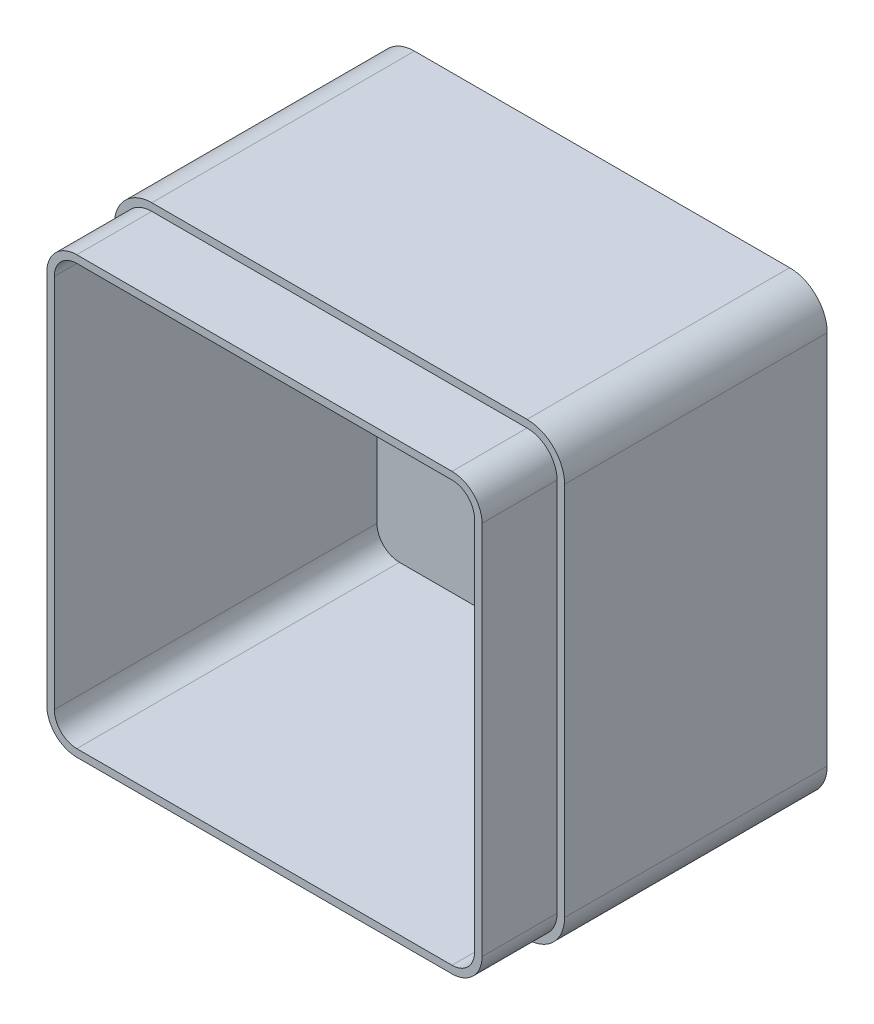
ISO-10303-21;
HEADER;
FILE_DESCRIPTION(('STEP AP214'),'2;1');
FILE_NAME('part.step','',(''),(''),'','','');
FILE_SCHEMA(('AUTOMOTIVE_DESIGN { 1 0 10303 214 1 1 1 1 }'));
ENDSEC;
DATA;
#1=APPLICATION_CONTEXT('core data for automotive mechanical design processes');
#2=APPLICATION_PROTOCOL_DEFINITION('international standard','automotive_design',2000,#1);
#3=PRODUCT_CONTEXT('',#1,'mechanical');
#4=PRODUCT('Part','Part','',(#3));
#5=PRODUCT_RELATED_PRODUCT_CATEGORY('part','',(#4));
#6=PRODUCT_DEFINITION_FORMATION('','',#4);
#7=PRODUCT_DEFINITION_CONTEXT('part definition',#1,'design');
#8=PRODUCT_DEFINITION('design','',#6,#7);
#9=PRODUCT_DEFINITION_SHAPE('','',#8);
#10=(LENGTH_UNIT() NAMED_UNIT(*) SI_UNIT(.MILLI.,.METRE.));
#11=(NAMED_UNIT(*) PLANE_ANGLE_UNIT() SI_UNIT($,.RADIAN.));
#12=(NAMED_UNIT(*) SI_UNIT($,.STERADIAN.) SOLID_ANGLE_UNIT());
#13=UNCERTAINTY_MEASURE_WITH_UNIT(LENGTH_MEASURE(1.E-05),#10,'distance_accuracy_value','');
#14=(GEOMETRIC_REPRESENTATION_CONTEXT(3) GLOBAL_UNCERTAINTY_ASSIGNED_CONTEXT((#13)) GLOBAL_UNIT_ASSIGNED_CONTEXT((#10,
#11,#12)) REPRESENTATION_CONTEXT('',''));
#15=CARTESIAN_POINT('',(0.,0.,0.));
#16=DIRECTION('',(0.,0.,1.));
#17=DIRECTION('',(1.,0.,0.));
#18=AXIS2_PLACEMENT_3D('',#15,#16,#17);
#19=CARTESIAN_POINT('',(0.,0.,90.));
#20=DIRECTION('',(0.,0.,-1.));
#21=DIRECTION('',(-1.,0.,0.));
#22=AXIS2_PLACEMENT_3D('',#19,#20,#21);
#23=PLANE('',#22);
#24=DIRECTION('',(0.,1.,0.));
#25=VECTOR('',#24,1.);
#26=CARTESIAN_POINT('',(116.,0.,90.));
#27=LINE('',#26,#25);
#28=CARTESIAN_POINT('',(116.,10.,90.));
#29=VERTEX_POINT('',#28);
#30=CARTESIAN_POINT('',(116.,110.,90.));
#31=VERTEX_POINT('',#30);
#32=EDGE_CURVE('E391',#29,#31,#27,.T.);
#33=ORIENTED_EDGE('',*,*,#32,.F.);
#34=CARTESIAN_POINT('',(110.,10.,90.));
#35=DIRECTION('',(0.,0.,-1.));
#36=DIRECTION('',(-1.,0.,0.));
#37=AXIS2_PLACEMENT_3D('',#34,#35,#36);
#38=CIRCLE('',#37,6.);
#39=CARTESIAN_POINT('',(110.,4.,90.));
#40=VERTEX_POINT('',#39);
#41=EDGE_CURVE('E373',#40,#29,#38,.F.);
#42=ORIENTED_EDGE('',*,*,#41,.F.);
#43=DIRECTION('',(1.,0.,0.));
#44=VECTOR('',#43,1.);
#45=CARTESIAN_POINT('',(0.,4.,90.));
#46=LINE('',#45,#44);
#47=CARTESIAN_POINT('',(9.99999999999999,4.,90.));
#48=VERTEX_POINT('',#47);
#49=EDGE_CURVE('E384',#48,#40,#46,.T.);
#50=ORIENTED_EDGE('',*,*,#49,.F.);
#51=CARTESIAN_POINT('',(9.99999999999999,10.,90.));
#52=DIRECTION('',(0.,0.,-1.));
#53=DIRECTION('',(-1.,0.,0.));
#54=AXIS2_PLACEMENT_3D('',#51,#52,#53);
#55=CIRCLE('',#54,6.);
#56=CARTESIAN_POINT('',(4.,10.,90.));
#57=VERTEX_POINT('',#56);
#58=EDGE_CURVE('E385',#57,#48,#55,.F.);
#59=ORIENTED_EDGE('',*,*,#58,.F.);
#60=DIRECTION('',(0.,-1.,0.));
#61=VECTOR('',#60,1.);
#62=CARTESIAN_POINT('',(4.,0.,90.));
#63=LINE('',#62,#61);
#64=CARTESIAN_POINT('',(3.99999999999999,110.,90.));
#65=VERTEX_POINT('',#64);
#66=EDGE_CURVE('E337',#65,#57,#63,.T.);
#67=ORIENTED_EDGE('',*,*,#66,.F.);
#68=CARTESIAN_POINT('',(9.99999999999999,110.,90.));
#69=DIRECTION('',(0.,0.,-1.));
#70=DIRECTION('',(-1.,0.,0.));
#71=AXIS2_PLACEMENT_3D('',#68,#69,#70);
#72=CIRCLE('',#71,6.);
#73=CARTESIAN_POINT('',(9.99999999999998,116.,90.));
#74=VERTEX_POINT('',#73);
#75=EDGE_CURVE('E388',#74,#65,#72,.F.);
#76=ORIENTED_EDGE('',*,*,#75,.F.);
#77=DIRECTION('',(-1.,0.,0.));
#78=VECTOR('',#77,1.);
#79=CARTESIAN_POINT('',(0.,116.,90.));
#80=LINE('',#79,#78);
#81=CARTESIAN_POINT('',(110.,116.,90.));
#82=VERTEX_POINT('',#81);
#83=EDGE_CURVE('E380',#82,#74,#80,.T.);
#84=ORIENTED_EDGE('',*,*,#83,.F.);
#85=CARTESIAN_POINT('',(110.,110.,90.));
#86=DIRECTION('',(0.,0.,-1.));
#87=DIRECTION('',(-1.,0.,0.));
#88=AXIS2_PLACEMENT_3D('',#85,#86,#87);
#89=CIRCLE('',#88,6.);
#90=EDGE_CURVE('E332',#31,#82,#89,.F.);
#91=ORIENTED_EDGE('',*,*,#90,.F.);
#92=EDGE_LOOP('',(#33,#42,#50,#59,#67,#76,#84,#91));
#93=FACE_BOUND('',#92,.T.);
#94=CARTESIAN_POINT('',(110.,10.,90.));
#95=DIRECTION('',(0.,0.,1.));
#96=DIRECTION('',(1.,0.,0.));
#97=AXIS2_PLACEMENT_3D('',#94,#95,#96);
#98=CIRCLE('',#97,7.99999999999999);
#99=CARTESIAN_POINT('',(110.,2.,90.));
#100=VERTEX_POINT('',#99);
#101=CARTESIAN_POINT('',(118.,10.,90.));
#102=VERTEX_POINT('',#101);
#103=EDGE_CURVE('E255',#100,#102,#98,.T.);
#104=ORIENTED_EDGE('',*,*,#103,.T.);
#105=DIRECTION('',(0.,1.,0.));
#106=VECTOR('',#105,1.);
#107=CARTESIAN_POINT('',(118.,10.,90.));
#108=LINE('',#107,#106);
#109=CARTESIAN_POINT('',(118.,110.,90.));
#110=VERTEX_POINT('',#109);
#111=EDGE_CURVE('E205',#102,#110,#108,.T.);
#112=ORIENTED_EDGE('',*,*,#111,.T.);
#113=CARTESIAN_POINT('',(110.,110.,90.));
#114=DIRECTION('',(0.,0.,1.));
#115=DIRECTION('',(1.,0.,0.));
#116=AXIS2_PLACEMENT_3D('',#113,#114,#115);
#117=CIRCLE('',#116,7.99999999999999);
#118=CARTESIAN_POINT('',(110.,118.,90.));
#119=VERTEX_POINT('',#118);
#120=EDGE_CURVE('E54',#110,#119,#117,.T.);
#121=ORIENTED_EDGE('',*,*,#120,.T.);
#122=DIRECTION('',(-1.,0.,0.));
#123=VECTOR('',#122,1.);
#124=CARTESIAN_POINT('',(110.,118.,90.));
#125=LINE('',#124,#123);
#126=CARTESIAN_POINT('',(9.99999999999998,118.,90.));
#127=VERTEX_POINT('',#126);
#128=EDGE_CURVE('E262',#119,#127,#125,.T.);
#129=ORIENTED_EDGE('',*,*,#128,.T.);
#130=CARTESIAN_POINT('',(9.99999999999999,110.,90.));
#131=DIRECTION('',(0.,0.,1.));
#132=DIRECTION('',(1.,0.,0.));
#133=AXIS2_PLACEMENT_3D('',#130,#131,#132);
#134=CIRCLE('',#133,7.99999999999999);
#135=CARTESIAN_POINT('',(1.99999999999999,110.,90.));
#136=VERTEX_POINT('',#135);
#137=EDGE_CURVE('E266',#127,#136,#134,.T.);
#138=ORIENTED_EDGE('',*,*,#137,.T.);
#139=DIRECTION('',(0.,-1.,0.));
#140=VECTOR('',#139,1.);
#141=CARTESIAN_POINT('',(1.99999999999999,110.,90.));
#142=LINE('',#141,#140);
#143=CARTESIAN_POINT('',(2.,9.99999999999999,90.));
#144=VERTEX_POINT('',#143);
#145=EDGE_CURVE('E270',#136,#144,#142,.T.);
#146=ORIENTED_EDGE('',*,*,#145,.T.);
#147=CARTESIAN_POINT('',(9.99999999999999,10.,90.));
#148=DIRECTION('',(0.,0.,1.));
#149=DIRECTION('',(1.,0.,0.));
#150=AXIS2_PLACEMENT_3D('',#147,#148,#149);
#151=CIRCLE('',#150,8.);
#152=CARTESIAN_POINT('',(9.99999999999999,2.,90.));
#153=VERTEX_POINT('',#152);
#154=EDGE_CURVE('E232',#144,#153,#151,.T.);
#155=ORIENTED_EDGE('',*,*,#154,.T.);
#156=DIRECTION('',(1.,0.,0.));
#157=VECTOR('',#156,1.);
#158=CARTESIAN_POINT('',(10.,2.,90.));
#159=LINE('',#158,#157);
#160=EDGE_CURVE('E228',#153,#100,#159,.T.);
#161=ORIENTED_EDGE('',*,*,#160,.T.);
#162=EDGE_LOOP('',(#104,#112,#121,#129,#138,#146,#155,#161));
#163=FACE_BOUND('',#162,.T.);
#164=ADVANCED_FACE('F38',(#93,#163),#23,.F.);
#165=CARTESIAN_POINT('',(4.,0.,90.));
#166=DIRECTION('',(1.,0.,0.));
#167=DIRECTION('',(0.,1.,0.));
#168=AXIS2_PLACEMENT_3D('',#165,#166,#167);
#169=PLANE('',#168);
#170=ORIENTED_EDGE('',*,*,#66,.T.);
#171=DIRECTION('',(0.,0.,1.));
#172=VECTOR('',#171,1.);
#173=CARTESIAN_POINT('',(4.,10.,90.));
#174=LINE('',#173,#172);
#175=CARTESIAN_POINT('',(4.,10.,4.));
#176=VERTEX_POINT('',#175);
#177=EDGE_CURVE('E325',#176,#57,#174,.T.);
#178=ORIENTED_EDGE('',*,*,#177,.F.);
#179=DIRECTION('',(0.,-1.,0.));
#180=VECTOR('',#179,1.);
#181=CARTESIAN_POINT('',(4.,0.,4.));
#182=LINE('',#181,#180);
#183=CARTESIAN_POINT('',(3.99999999999999,110.,4.));
#184=VERTEX_POINT('',#183);
#185=EDGE_CURVE('E319',#184,#176,#182,.T.);
#186=ORIENTED_EDGE('',*,*,#185,.F.);
#187=DIRECTION('',(0.,0.,1.));
#188=VECTOR('',#187,1.);
#189=CARTESIAN_POINT('',(3.99999999999999,110.,90.));
#190=LINE('',#189,#188);
#191=EDGE_CURVE('E320',#65,#184,#190,.F.);
#192=ORIENTED_EDGE('',*,*,#191,.F.);
#193=EDGE_LOOP('',(#170,#178,#186,#192));
#194=FACE_BOUND('',#193,.T.);
#195=ADVANCED_FACE('F505',(#194),#169,.T.);
#196=CARTESIAN_POINT('',(0.,4.,90.));
#197=DIRECTION('',(0.,1.,0.));
#198=DIRECTION('',(0.,0.,1.));
#199=AXIS2_PLACEMENT_3D('',#196,#197,#198);
#200=PLANE('',#199);
#201=ORIENTED_EDGE('',*,*,#49,.T.);
#202=DIRECTION('',(0.,0.,1.));
#203=VECTOR('',#202,1.);
#204=CARTESIAN_POINT('',(110.,4.,90.));
#205=LINE('',#204,#203);
#206=CARTESIAN_POINT('',(110.,4.,4.));
#207=VERTEX_POINT('',#206);
#208=EDGE_CURVE('E324',#207,#40,#205,.T.);
#209=ORIENTED_EDGE('',*,*,#208,.F.);
#210=DIRECTION('',(1.,0.,0.));
#211=VECTOR('',#210,1.);
#212=CARTESIAN_POINT('',(0.,4.,4.));
#213=LINE('',#212,#211);
#214=CARTESIAN_POINT('',(9.99999999999999,4.,4.));
#215=VERTEX_POINT('',#214);
#216=EDGE_CURVE('E329',#215,#207,#213,.T.);
#217=ORIENTED_EDGE('',*,*,#216,.F.);
#218=DIRECTION('',(0.,0.,1.));
#219=VECTOR('',#218,1.);
#220=CARTESIAN_POINT('',(9.99999999999999,4.,90.));
#221=LINE('',#220,#219);
#222=EDGE_CURVE('E359',#48,#215,#221,.F.);
#223=ORIENTED_EDGE('',*,*,#222,.F.);
#224=EDGE_LOOP('',(#201,#209,#217,#223));
#225=FACE_BOUND('',#224,.T.);
#226=ADVANCED_FACE('F511',(#225),#200,.T.);
#227=CARTESIAN_POINT('',(116.,0.,90.));
#228=DIRECTION('',(-1.,0.,0.));
#229=DIRECTION('',(0.,-1.,0.));
#230=AXIS2_PLACEMENT_3D('',#227,#228,#229);
#231=PLANE('',#230);
#232=DIRECTION('',(0.,1.,0.));
#233=VECTOR('',#232,1.);
#234=CARTESIAN_POINT('',(116.,0.,4.));
#235=LINE('',#234,#233);
#236=CARTESIAN_POINT('',(116.,10.,4.));
#237=VERTEX_POINT('',#236);
#238=CARTESIAN_POINT('',(116.,110.,4.));
#239=VERTEX_POINT('',#238);
#240=EDGE_CURVE('E338',#237,#239,#235,.T.);
#241=ORIENTED_EDGE('',*,*,#240,.F.);
#242=DIRECTION('',(0.,0.,1.));
#243=VECTOR('',#242,1.);
#244=CARTESIAN_POINT('',(116.,10.,90.));
#245=LINE('',#244,#243);
#246=EDGE_CURVE('E342',#29,#237,#245,.F.);
#247=ORIENTED_EDGE('',*,*,#246,.F.);
#248=ORIENTED_EDGE('',*,*,#32,.T.);
#249=DIRECTION('',(0.,0.,1.));
#250=VECTOR('',#249,1.);
#251=CARTESIAN_POINT('',(116.,110.,90.));
#252=LINE('',#251,#250);
#253=EDGE_CURVE('E370',#239,#31,#252,.T.);
#254=ORIENTED_EDGE('',*,*,#253,.F.);
#255=EDGE_LOOP('',(#241,#247,#248,#254));
#256=FACE_BOUND('',#255,.T.);
#257=ADVANCED_FACE('F540',(#256),#231,.T.);
#258=CARTESIAN_POINT('',(0.,116.,90.));
#259=DIRECTION('',(0.,-1.,0.));
#260=DIRECTION('',(0.,0.,-1.));
#261=AXIS2_PLACEMENT_3D('',#258,#259,#260);
#262=PLANE('',#261);
#263=ORIENTED_EDGE('',*,*,#83,.T.);
#264=DIRECTION('',(0.,0.,-1.));
#265=VECTOR('',#264,1.);
#266=CARTESIAN_POINT('',(9.99999999999998,116.,90.));
#267=LINE('',#266,#265);
#268=CARTESIAN_POINT('',(9.99999999999998,116.,4.));
#269=VERTEX_POINT('',#268);
#270=EDGE_CURVE('E377',#269,#74,#267,.F.);
#271=ORIENTED_EDGE('',*,*,#270,.F.);
#272=DIRECTION('',(-1.,0.,0.));
#273=VECTOR('',#272,1.);
#274=CARTESIAN_POINT('',(0.,116.,4.));
#275=LINE('',#274,#273);
#276=CARTESIAN_POINT('',(110.,116.,4.));
#277=VERTEX_POINT('',#276);
#278=EDGE_CURVE('E333',#277,#269,#275,.T.);
#279=ORIENTED_EDGE('',*,*,#278,.F.);
#280=DIRECTION('',(0.,0.,-1.));
#281=VECTOR('',#280,1.);
#282=CARTESIAN_POINT('',(110.,116.,90.));
#283=LINE('',#282,#281);
#284=EDGE_CURVE('E351',#82,#277,#283,.T.);
#285=ORIENTED_EDGE('',*,*,#284,.F.);
#286=EDGE_LOOP('',(#263,#271,#279,#285));
#287=FACE_BOUND('',#286,.T.);
#288=ADVANCED_FACE('F536',(#287),#262,.T.);
#289=CARTESIAN_POINT('',(0.,0.,4.));
#290=DIRECTION('',(0.,0.,-1.));
#291=DIRECTION('',(-1.,0.,0.));
#292=AXIS2_PLACEMENT_3D('',#289,#290,#291);
#293=PLANE('',#292);
#294=ORIENTED_EDGE('',*,*,#278,.T.);
#295=CARTESIAN_POINT('',(9.99999999999999,110.,4.));
#296=DIRECTION('',(0.,0.,-1.));
#297=DIRECTION('',(-1.,0.,0.));
#298=AXIS2_PLACEMENT_3D('',#295,#296,#297);
#299=CIRCLE('',#298,6.);
#300=EDGE_CURVE('E343',#184,#269,#299,.T.);
#301=ORIENTED_EDGE('',*,*,#300,.F.);
#302=ORIENTED_EDGE('',*,*,#185,.T.);
#303=CARTESIAN_POINT('',(9.99999999999999,10.,4.));
#304=DIRECTION('',(0.,0.,-1.));
#305=DIRECTION('',(-1.,0.,0.));
#306=AXIS2_PLACEMENT_3D('',#303,#304,#305);
#307=CIRCLE('',#306,6.);
#308=EDGE_CURVE('E350',#215,#176,#307,.T.);
#309=ORIENTED_EDGE('',*,*,#308,.F.);
#310=ORIENTED_EDGE('',*,*,#216,.T.);
#311=CARTESIAN_POINT('',(110.,10.,4.));
#312=DIRECTION('',(0.,0.,-1.));
#313=DIRECTION('',(-1.,0.,0.));
#314=AXIS2_PLACEMENT_3D('',#311,#312,#313);
#315=CIRCLE('',#314,6.);
#316=EDGE_CURVE('E347',#237,#207,#315,.T.);
#317=ORIENTED_EDGE('',*,*,#316,.F.);
#318=ORIENTED_EDGE('',*,*,#240,.T.);
#319=CARTESIAN_POINT('',(110.,110.,4.));
#320=DIRECTION('',(0.,0.,-1.));
#321=DIRECTION('',(-1.,0.,0.));
#322=AXIS2_PLACEMENT_3D('',#319,#320,#321);
#323=CIRCLE('',#322,6.);
#324=EDGE_CURVE('E339',#277,#239,#323,.T.);
#325=ORIENTED_EDGE('',*,*,#324,.F.);
#326=EDGE_LOOP('',(#294,#301,#302,#309,#310,#317,#318,#325));
#327=FACE_BOUND('',#326,.T.);
#328=ADVANCED_FACE('F532',(#327),#293,.F.);
#329=CARTESIAN_POINT('',(110.,110.,90.));
#330=DIRECTION('',(0.,0.,-1.));
#331=DIRECTION('',(-1.,0.,0.));
#332=AXIS2_PLACEMENT_3D('',#329,#330,#331);
#333=CYLINDRICAL_SURFACE('',#332,6.);
#334=ORIENTED_EDGE('',*,*,#90,.T.);
#335=ORIENTED_EDGE('',*,*,#284,.T.);
#336=ORIENTED_EDGE('',*,*,#324,.T.);
#337=ORIENTED_EDGE('',*,*,#253,.T.);
#338=EDGE_LOOP('',(#334,#335,#336,#337));
#339=FACE_BOUND('',#338,.T.);
#340=ADVANCED_FACE('F528',(#339),#333,.F.);
#341=CARTESIAN_POINT('',(9.99999999999999,110.,90.));
#342=DIRECTION('',(0.,0.,-1.));
#343=DIRECTION('',(-1.,0.,0.));
#344=AXIS2_PLACEMENT_3D('',#341,#342,#343);
#345=CYLINDRICAL_SURFACE('',#344,6.);
#346=ORIENTED_EDGE('',*,*,#75,.T.);
#347=ORIENTED_EDGE('',*,*,#191,.T.);
#348=ORIENTED_EDGE('',*,*,#300,.T.);
#349=ORIENTED_EDGE('',*,*,#270,.T.);
#350=EDGE_LOOP('',(#346,#347,#348,#349));
#351=FACE_BOUND('',#350,.T.);
#352=ADVANCED_FACE('F524',(#351),#345,.F.);
#353=CARTESIAN_POINT('',(9.99999999999999,10.,90.));
#354=DIRECTION('',(0.,0.,-1.));
#355=DIRECTION('',(-1.,0.,0.));
#356=AXIS2_PLACEMENT_3D('',#353,#354,#355);
#357=CYLINDRICAL_SURFACE('',#356,6.);
#358=ORIENTED_EDGE('',*,*,#58,.T.);
#359=ORIENTED_EDGE('',*,*,#222,.T.);
#360=ORIENTED_EDGE('',*,*,#308,.T.);
#361=ORIENTED_EDGE('',*,*,#177,.T.);
#362=EDGE_LOOP('',(#358,#359,#360,#361));
#363=FACE_BOUND('',#362,.T.);
#364=ADVANCED_FACE('F520',(#363),#357,.F.);
#365=CARTESIAN_POINT('',(110.,10.,90.));
#366=DIRECTION('',(0.,0.,-1.));
#367=DIRECTION('',(-1.,0.,0.));
#368=AXIS2_PLACEMENT_3D('',#365,#366,#367);
#369=CYLINDRICAL_SURFACE('',#368,6.);
#370=ORIENTED_EDGE('',*,*,#41,.T.);
#371=ORIENTED_EDGE('',*,*,#246,.T.);
#372=ORIENTED_EDGE('',*,*,#316,.T.);
#373=ORIENTED_EDGE('',*,*,#208,.T.);
#374=EDGE_LOOP('',(#370,#371,#372,#373));
#375=FACE_BOUND('',#374,.T.);
#376=ADVANCED_FACE('F517',(#375),#369,.F.);
#377=CARTESIAN_POINT('',(110.,10.,70.));
#378=DIRECTION('',(0.,0.,1.));
#379=DIRECTION('',(1.,0.,0.));
#380=AXIS2_PLACEMENT_3D('',#377,#378,#379);
#381=PLANE('',#380);
#382=DIRECTION('',(1.,0.,0.));
#383=VECTOR('',#382,1.);
#384=CARTESIAN_POINT('',(10.,2.,70.));
#385=LINE('',#384,#383);
#386=CARTESIAN_POINT('',(9.99999999999999,2.,70.));
#387=VERTEX_POINT('',#386);
#388=CARTESIAN_POINT('',(110.,2.,70.));
#389=VERTEX_POINT('',#388);
#390=EDGE_CURVE('E212',#387,#389,#385,.T.);
#391=ORIENTED_EDGE('',*,*,#390,.F.);
#392=CARTESIAN_POINT('',(9.99999999999999,10.,70.));
#393=DIRECTION('',(0.,0.,1.));
#394=DIRECTION('',(1.,0.,0.));
#395=AXIS2_PLACEMENT_3D('',#392,#393,#394);
#396=CIRCLE('',#395,8.);
#397=CARTESIAN_POINT('',(2.,9.99999999999999,70.));
#398=VERTEX_POINT('',#397);
#399=EDGE_CURVE('E249',#398,#387,#396,.T.);
#400=ORIENTED_EDGE('',*,*,#399,.F.);
#401=DIRECTION('',(0.,-1.,0.));
#402=VECTOR('',#401,1.);
#403=CARTESIAN_POINT('',(1.99999999999999,110.,70.));
#404=LINE('',#403,#402);
#405=CARTESIAN_POINT('',(1.99999999999999,110.,70.));
#406=VERTEX_POINT('',#405);
#407=EDGE_CURVE('E245',#406,#398,#404,.T.);
#408=ORIENTED_EDGE('',*,*,#407,.F.);
#409=CARTESIAN_POINT('',(9.99999999999999,110.,70.));
#410=DIRECTION('',(0.,0.,1.));
#411=DIRECTION('',(1.,0.,0.));
#412=AXIS2_PLACEMENT_3D('',#409,#410,#411);
#413=CIRCLE('',#412,7.99999999999999);
#414=CARTESIAN_POINT('',(9.99999999999998,118.,70.));
#415=VERTEX_POINT('',#414);
#416=EDGE_CURVE('E241',#415,#406,#413,.T.);
#417=ORIENTED_EDGE('',*,*,#416,.F.);
#418=DIRECTION('',(-1.,0.,0.));
#419=VECTOR('',#418,1.);
#420=CARTESIAN_POINT('',(110.,118.,70.));
#421=LINE('',#420,#419);
#422=CARTESIAN_POINT('',(110.,118.,70.));
#423=VERTEX_POINT('',#422);
#424=EDGE_CURVE('E237',#423,#415,#421,.T.);
#425=ORIENTED_EDGE('',*,*,#424,.F.);
#426=CARTESIAN_POINT('',(110.,110.,70.));
#427=DIRECTION('',(0.,0.,1.));
#428=DIRECTION('',(1.,0.,0.));
#429=AXIS2_PLACEMENT_3D('',#426,#427,#428);
#430=CIRCLE('',#429,7.99999999999999);
#431=CARTESIAN_POINT('',(118.,110.,70.));
#432=VERTEX_POINT('',#431);
#433=EDGE_CURVE('E222',#432,#423,#430,.T.);
#434=ORIENTED_EDGE('',*,*,#433,.F.);
#435=DIRECTION('',(0.,1.,0.));
#436=VECTOR('',#435,1.);
#437=CARTESIAN_POINT('',(118.,10.,70.));
#438=LINE('',#437,#436);
#439=CARTESIAN_POINT('',(118.,10.,70.));
#440=VERTEX_POINT('',#439);
#441=EDGE_CURVE('E203',#440,#432,#438,.T.);
#442=ORIENTED_EDGE('',*,*,#441,.F.);
#443=CARTESIAN_POINT('',(110.,10.,70.));
#444=DIRECTION('',(0.,0.,1.));
#445=DIRECTION('',(1.,0.,0.));
#446=AXIS2_PLACEMENT_3D('',#443,#444,#445);
#447=CIRCLE('',#446,7.99999999999999);
#448=EDGE_CURVE('E218',#389,#440,#447,.T.);
#449=ORIENTED_EDGE('',*,*,#448,.F.);
#450=EDGE_LOOP('',(#391,#400,#408,#417,#425,#434,#442,#449));
#451=FACE_BOUND('',#450,.T.);
#452=CARTESIAN_POINT('',(110.,10.,70.));
#453=DIRECTION('',(0.,0.,1.));
#454=DIRECTION('',(1.,0.,0.));
#455=AXIS2_PLACEMENT_3D('',#452,#453,#454);
#456=CIRCLE('',#455,9.99999999999999);
#457=CARTESIAN_POINT('',(110.,0.,70.));
#458=VERTEX_POINT('',#457);
#459=CARTESIAN_POINT('',(120.,10.,70.));
#460=VERTEX_POINT('',#459);
#461=EDGE_CURVE('E279',#458,#460,#456,.T.);
#462=ORIENTED_EDGE('',*,*,#461,.T.);
#463=DIRECTION('',(0.,1.,0.));
#464=VECTOR('',#463,1.);
#465=CARTESIAN_POINT('',(120.,10.,70.));
#466=LINE('',#465,#464);
#467=CARTESIAN_POINT('',(120.,110.,70.));
#468=VERTEX_POINT('',#467);
#469=EDGE_CURVE('E299',#460,#468,#466,.T.);
#470=ORIENTED_EDGE('',*,*,#469,.T.);
#471=CARTESIAN_POINT('',(110.,110.,70.));
#472=DIRECTION('',(0.,0.,1.));
#473=DIRECTION('',(1.,0.,0.));
#474=AXIS2_PLACEMENT_3D('',#471,#472,#473);
#475=CIRCLE('',#474,9.99999999999999);
#476=CARTESIAN_POINT('',(110.,120.,70.));
#477=VERTEX_POINT('',#476);
#478=EDGE_CURVE('E302',#468,#477,#475,.T.);
#479=ORIENTED_EDGE('',*,*,#478,.T.);
#480=DIRECTION('',(-1.,0.,0.));
#481=VECTOR('',#480,1.);
#482=CARTESIAN_POINT('',(110.,120.,70.));
#483=LINE('',#482,#481);
#484=CARTESIAN_POINT('',(9.99999999999998,120.,70.));
#485=VERTEX_POINT('',#484);
#486=EDGE_CURVE('E305',#477,#485,#483,.T.);
#487=ORIENTED_EDGE('',*,*,#486,.T.);
#488=CARTESIAN_POINT('',(9.99999999999999,110.,70.));
#489=DIRECTION('',(0.,0.,1.));
#490=DIRECTION('',(1.,0.,0.));
#491=AXIS2_PLACEMENT_3D('',#488,#489,#490);
#492=CIRCLE('',#491,9.99999999999999);
#493=CARTESIAN_POINT('',(0.,110.,70.));
#494=VERTEX_POINT('',#493);
#495=EDGE_CURVE('E308',#485,#494,#492,.T.);
#496=ORIENTED_EDGE('',*,*,#495,.T.);
#497=DIRECTION('',(0.,-1.,0.));
#498=VECTOR('',#497,1.);
#499=CARTESIAN_POINT('',(0.,110.,70.));
#500=LINE('',#499,#498);
#501=CARTESIAN_POINT('',(0.,10.,70.));
#502=VERTEX_POINT('',#501);
#503=EDGE_CURVE('E311',#494,#502,#500,.T.);
#504=ORIENTED_EDGE('',*,*,#503,.T.);
#505=CARTESIAN_POINT('',(9.99999999999999,10.,70.));
#506=DIRECTION('',(0.,0.,1.));
#507=DIRECTION('',(1.,0.,0.));
#508=AXIS2_PLACEMENT_3D('',#505,#506,#507);
#509=CIRCLE('',#508,10.);
#510=CARTESIAN_POINT('',(9.99999999999999,0.,70.));
#511=VERTEX_POINT('',#510);
#512=EDGE_CURVE('E314',#502,#511,#509,.T.);
#513=ORIENTED_EDGE('',*,*,#512,.T.);
#514=DIRECTION('',(1.,0.,0.));
#515=VECTOR('',#514,1.);
#516=CARTESIAN_POINT('',(9.99999999999999,0.,70.));
#517=LINE('',#516,#515);
#518=EDGE_CURVE('E62',#511,#458,#517,.T.);
#519=ORIENTED_EDGE('',*,*,#518,.T.);
#520=EDGE_LOOP('',(#462,#470,#479,#487,#496,#504,#513,#519));
#521=FACE_BOUND('',#520,.T.);
#522=ADVANCED_FACE('F217',(#451,#521),#381,.T.);
#523=CARTESIAN_POINT('',(110.,10.,70.));
#524=DIRECTION('',(0.,0.,1.));
#525=DIRECTION('',(1.,0.,0.));
#526=AXIS2_PLACEMENT_3D('',#523,#524,#525);
#527=CYLINDRICAL_SURFACE('',#526,7.99999999999999);
#528=ORIENTED_EDGE('',*,*,#103,.F.);
#529=DIRECTION('',(0.,0.,1.));
#530=VECTOR('',#529,1.);
#531=CARTESIAN_POINT('',(110.,2.,70.));
#532=LINE('',#531,#530);
#533=EDGE_CURVE('E226',#389,#100,#532,.T.);
#534=ORIENTED_EDGE('',*,*,#533,.F.);
#535=ORIENTED_EDGE('',*,*,#448,.T.);
#536=DIRECTION('',(0.,0.,1.));
#537=VECTOR('',#536,1.);
#538=CARTESIAN_POINT('',(118.,10.,70.));
#539=LINE('',#538,#537);
#540=EDGE_CURVE('E200',#440,#102,#539,.T.);
#541=ORIENTED_EDGE('',*,*,#540,.T.);
#542=EDGE_LOOP('',(#528,#534,#535,#541));
#543=FACE_BOUND('',#542,.T.);
#544=ADVANCED_FACE('F225',(#543),#527,.T.);
#545=CARTESIAN_POINT('',(10.,2.,70.));
#546=DIRECTION('',(0.,-1.,0.));
#547=DIRECTION('',(0.,0.,-1.));
#548=AXIS2_PLACEMENT_3D('',#545,#546,#547);
#549=PLANE('',#548);
#550=ORIENTED_EDGE('',*,*,#160,.F.);
#551=DIRECTION('',(0.,0.,1.));
#552=VECTOR('',#551,1.);
#553=CARTESIAN_POINT('',(9.99999999999999,2.,70.));
#554=LINE('',#553,#552);
#555=EDGE_CURVE('E280',#387,#153,#554,.T.);
#556=ORIENTED_EDGE('',*,*,#555,.F.);
#557=ORIENTED_EDGE('',*,*,#390,.T.);
#558=ORIENTED_EDGE('',*,*,#533,.T.);
#559=EDGE_LOOP('',(#550,#556,#557,#558));
#560=FACE_BOUND('',#559,.T.);
#561=ADVANCED_FACE('F551',(#560),#549,.T.);
#562=CARTESIAN_POINT('',(9.99999999999999,10.,70.));
#563=DIRECTION('',(0.,0.,1.));
#564=DIRECTION('',(1.,0.,0.));
#565=AXIS2_PLACEMENT_3D('',#562,#563,#564);
#566=CYLINDRICAL_SURFACE('',#565,8.);
#567=ORIENTED_EDGE('',*,*,#154,.F.);
#568=DIRECTION('',(0.,0.,1.));
#569=VECTOR('',#568,1.);
#570=CARTESIAN_POINT('',(2.,9.99999999999999,70.));
#571=LINE('',#570,#569);
#572=EDGE_CURVE('E283',#398,#144,#571,.T.);
#573=ORIENTED_EDGE('',*,*,#572,.F.);
#574=ORIENTED_EDGE('',*,*,#399,.T.);
#575=ORIENTED_EDGE('',*,*,#555,.T.);
#576=EDGE_LOOP('',(#567,#573,#574,#575));
#577=FACE_BOUND('',#576,.T.);
#578=ADVANCED_FACE('F566',(#577),#566,.T.);
#579=CARTESIAN_POINT('',(1.99999999999999,110.,70.));
#580=DIRECTION('',(-1.,0.,0.));
#581=DIRECTION('',(0.,-1.,0.));
#582=AXIS2_PLACEMENT_3D('',#579,#580,#581);
#583=PLANE('',#582);
#584=ORIENTED_EDGE('',*,*,#145,.F.);
#585=DIRECTION('',(0.,0.,1.));
#586=VECTOR('',#585,1.);
#587=CARTESIAN_POINT('',(1.99999999999999,110.,70.));
#588=LINE('',#587,#586);
#589=EDGE_CURVE('E286',#406,#136,#588,.T.);
#590=ORIENTED_EDGE('',*,*,#589,.F.);
#591=ORIENTED_EDGE('',*,*,#407,.T.);
#592=ORIENTED_EDGE('',*,*,#572,.T.);
#593=EDGE_LOOP('',(#584,#590,#591,#592));
#594=FACE_BOUND('',#593,.T.);
#595=ADVANCED_FACE('F562',(#594),#583,.T.);
#596=CARTESIAN_POINT('',(9.99999999999999,110.,70.));
#597=DIRECTION('',(0.,0.,1.));
#598=DIRECTION('',(1.,0.,0.));
#599=AXIS2_PLACEMENT_3D('',#596,#597,#598);
#600=CYLINDRICAL_SURFACE('',#599,7.99999999999999);
#601=ORIENTED_EDGE('',*,*,#137,.F.);
#602=DIRECTION('',(0.,0.,1.));
#603=VECTOR('',#602,1.);
#604=CARTESIAN_POINT('',(9.99999999999998,118.,70.));
#605=LINE('',#604,#603);
#606=EDGE_CURVE('E289',#415,#127,#605,.T.);
#607=ORIENTED_EDGE('',*,*,#606,.F.);
#608=ORIENTED_EDGE('',*,*,#416,.T.);
#609=ORIENTED_EDGE('',*,*,#589,.T.);
#610=EDGE_LOOP('',(#601,#607,#608,#609));
#611=FACE_BOUND('',#610,.T.);
#612=ADVANCED_FACE('F558',(#611),#600,.T.);
#613=CARTESIAN_POINT('',(110.,118.,70.));
#614=DIRECTION('',(0.,1.,0.));
#615=DIRECTION('',(0.,0.,1.));
#616=AXIS2_PLACEMENT_3D('',#613,#614,#615);
#617=PLANE('',#616);
#618=ORIENTED_EDGE('',*,*,#128,.F.);
#619=DIRECTION('',(0.,0.,1.));
#620=VECTOR('',#619,1.);
#621=CARTESIAN_POINT('',(110.,118.,70.));
#622=LINE('',#621,#620);
#623=EDGE_CURVE('E292',#423,#119,#622,.T.);
#624=ORIENTED_EDGE('',*,*,#623,.F.);
#625=ORIENTED_EDGE('',*,*,#424,.T.);
#626=ORIENTED_EDGE('',*,*,#606,.T.);
#627=EDGE_LOOP('',(#618,#624,#625,#626));
#628=FACE_BOUND('',#627,.T.);
#629=ADVANCED_FACE('F555',(#628),#617,.T.);
#630=CARTESIAN_POINT('',(110.,110.,70.));
#631=DIRECTION('',(0.,0.,1.));
#632=DIRECTION('',(1.,0.,0.));
#633=AXIS2_PLACEMENT_3D('',#630,#631,#632);
#634=CYLINDRICAL_SURFACE('',#633,7.99999999999999);
#635=ORIENTED_EDGE('',*,*,#120,.F.);
#636=DIRECTION('',(0.,0.,1.));
#637=VECTOR('',#636,1.);
#638=CARTESIAN_POINT('',(118.,110.,70.));
#639=LINE('',#638,#637);
#640=EDGE_CURVE('E211',#432,#110,#639,.T.);
#641=ORIENTED_EDGE('',*,*,#640,.F.);
#642=ORIENTED_EDGE('',*,*,#433,.T.);
#643=ORIENTED_EDGE('',*,*,#623,.T.);
#644=EDGE_LOOP('',(#635,#641,#642,#643));
#645=FACE_BOUND('',#644,.T.);
#646=ADVANCED_FACE('F500',(#645),#634,.T.);
#647=CARTESIAN_POINT('',(118.,10.,70.));
#648=DIRECTION('',(1.,0.,0.));
#649=DIRECTION('',(0.,1.,0.));
#650=AXIS2_PLACEMENT_3D('',#647,#648,#649);
#651=PLANE('',#650);
#652=ORIENTED_EDGE('',*,*,#111,.F.);
#653=ORIENTED_EDGE('',*,*,#540,.F.);
#654=ORIENTED_EDGE('',*,*,#441,.T.);
#655=ORIENTED_EDGE('',*,*,#640,.T.);
#656=EDGE_LOOP('',(#652,#653,#654,#655));
#657=FACE_BOUND('',#656,.T.);
#658=ADVANCED_FACE('F202',(#657),#651,.T.);
#659=CARTESIAN_POINT('',(0.,0.,0.));
#660=DIRECTION('',(0.,0.,-1.));
#661=DIRECTION('',(-1.,0.,0.));
#662=AXIS2_PLACEMENT_3D('',#659,#660,#661);
#663=PLANE('',#662);
#664=DIRECTION('',(-1.,0.,0.));
#665=VECTOR('',#664,1.);
#666=CARTESIAN_POINT('',(0.,120.,0.));
#667=LINE('',#666,#665);
#668=CARTESIAN_POINT('',(110.,120.,0.));
#669=VERTEX_POINT('',#668);
#670=CARTESIAN_POINT('',(9.99999999999998,120.,0.));
#671=VERTEX_POINT('',#670);
#672=EDGE_CURVE('E415',#669,#671,#667,.T.);
#673=ORIENTED_EDGE('',*,*,#672,.F.);
#674=CARTESIAN_POINT('',(110.,110.,0.));
#675=DIRECTION('',(0.,0.,-1.));
#676=DIRECTION('',(-1.,0.,0.));
#677=AXIS2_PLACEMENT_3D('',#674,#675,#676);
#678=CIRCLE('',#677,10.);
#679=CARTESIAN_POINT('',(120.,110.,0.));
#680=VERTEX_POINT('',#679);
#681=EDGE_CURVE('E435',#669,#680,#678,.T.);
#682=ORIENTED_EDGE('',*,*,#681,.T.);
#683=DIRECTION('',(0.,1.,0.));
#684=VECTOR('',#683,1.);
#685=CARTESIAN_POINT('',(120.,0.,0.));
#686=LINE('',#685,#684);
#687=CARTESIAN_POINT('',(120.,10.,0.));
#688=VERTEX_POINT('',#687);
#689=EDGE_CURVE('E411',#688,#680,#686,.T.);
#690=ORIENTED_EDGE('',*,*,#689,.F.);
#691=CARTESIAN_POINT('',(110.,10.,0.));
#692=DIRECTION('',(0.,0.,-1.));
#693=DIRECTION('',(-1.,0.,0.));
#694=AXIS2_PLACEMENT_3D('',#691,#692,#693);
#695=CIRCLE('',#694,10.);
#696=CARTESIAN_POINT('',(110.,0.,0.));
#697=VERTEX_POINT('',#696);
#698=EDGE_CURVE('E426',#688,#697,#695,.T.);
#699=ORIENTED_EDGE('',*,*,#698,.T.);
#700=DIRECTION('',(1.,0.,0.));
#701=VECTOR('',#700,1.);
#702=CARTESIAN_POINT('',(0.,0.,0.));
#703=LINE('',#702,#701);
#704=CARTESIAN_POINT('',(9.99999999999999,0.,0.));
#705=VERTEX_POINT('',#704);
#706=EDGE_CURVE('E407',#705,#697,#703,.T.);
#707=ORIENTED_EDGE('',*,*,#706,.F.);
#708=CARTESIAN_POINT('',(9.99999999999999,10.,0.));
#709=DIRECTION('',(0.,0.,-1.));
#710=DIRECTION('',(-1.,0.,0.));
#711=AXIS2_PLACEMENT_3D('',#708,#709,#710);
#712=CIRCLE('',#711,10.);
#713=CARTESIAN_POINT('',(0.,10.,0.));
#714=VERTEX_POINT('',#713);
#715=EDGE_CURVE('E429',#705,#714,#712,.T.);
#716=ORIENTED_EDGE('',*,*,#715,.T.);
#717=DIRECTION('',(0.,-1.,0.));
#718=VECTOR('',#717,1.);
#719=CARTESIAN_POINT('',(0.,0.,0.));
#720=LINE('',#719,#718);
#721=CARTESIAN_POINT('',(0.,110.,0.));
#722=VERTEX_POINT('',#721);
#723=EDGE_CURVE('E363',#722,#714,#720,.T.);
#724=ORIENTED_EDGE('',*,*,#723,.F.);
#725=CARTESIAN_POINT('',(9.99999999999999,110.,0.));
#726=DIRECTION('',(0.,0.,-1.));
#727=DIRECTION('',(-1.,0.,0.));
#728=AXIS2_PLACEMENT_3D('',#725,#726,#727);
#729=CIRCLE('',#728,10.);
#730=EDGE_CURVE('E432',#722,#671,#729,.T.);
#731=ORIENTED_EDGE('',*,*,#730,.T.);
#732=EDGE_LOOP('',(#673,#682,#690,#699,#707,#716,#724,#731));
#733=FACE_BOUND('',#732,.T.);
#734=ADVANCED_FACE('F491',(#733),#663,.T.);
#735=CARTESIAN_POINT('',(9.99999999999999,110.,90.));
#736=DIRECTION('',(0.,0.,-1.));
#737=DIRECTION('',(-1.,0.,0.));
#738=AXIS2_PLACEMENT_3D('',#735,#736,#737);
#739=CYLINDRICAL_SURFACE('',#738,10.);
#740=DIRECTION('',(0.,0.,-1.));
#741=VECTOR('',#740,1.);
#742=CARTESIAN_POINT('',(0.,110.,90.));
#743=LINE('',#742,#741);
#744=EDGE_CURVE('E449',#494,#722,#743,.T.);
#745=ORIENTED_EDGE('',*,*,#744,.F.);
#746=ORIENTED_EDGE('',*,*,#495,.F.);
#747=DIRECTION('',(0.,0.,-1.));
#748=VECTOR('',#747,1.);
#749=CARTESIAN_POINT('',(9.99999999999999,120.,90.));
#750=LINE('',#749,#748);
#751=EDGE_CURVE('E419',#671,#485,#750,.F.);
#752=ORIENTED_EDGE('',*,*,#751,.F.);
#753=ORIENTED_EDGE('',*,*,#730,.F.);
#754=EDGE_LOOP('',(#745,#746,#752,#753));
#755=FACE_BOUND('',#754,.T.);
#756=ADVANCED_FACE('F480',(#755),#739,.T.);
#757=CARTESIAN_POINT('',(110.,110.,90.));
#758=DIRECTION('',(0.,0.,-1.));
#759=DIRECTION('',(-1.,0.,0.));
#760=AXIS2_PLACEMENT_3D('',#757,#758,#759);
#761=CYLINDRICAL_SURFACE('',#760,10.);
#762=DIRECTION('',(0.,0.,-1.));
#763=VECTOR('',#762,1.);
#764=CARTESIAN_POINT('',(110.,120.,90.));
#765=LINE('',#764,#763);
#766=EDGE_CURVE('E423',#477,#669,#765,.T.);
#767=ORIENTED_EDGE('',*,*,#766,.F.);
#768=ORIENTED_EDGE('',*,*,#478,.F.);
#769=DIRECTION('',(0.,0.,-1.));
#770=VECTOR('',#769,1.);
#771=CARTESIAN_POINT('',(120.,110.,90.));
#772=LINE('',#771,#770);
#773=EDGE_CURVE('E441',#680,#468,#772,.F.);
#774=ORIENTED_EDGE('',*,*,#773,.F.);
#775=ORIENTED_EDGE('',*,*,#681,.F.);
#776=EDGE_LOOP('',(#767,#768,#774,#775));
#777=FACE_BOUND('',#776,.T.);
#778=ADVANCED_FACE('F470',(#777),#761,.T.);
#779=CARTESIAN_POINT('',(0.,120.,90.));
#780=DIRECTION('',(0.,-1.,0.));
#781=DIRECTION('',(0.,0.,-1.));
#782=AXIS2_PLACEMENT_3D('',#779,#780,#781);
#783=PLANE('',#782);
#784=ORIENTED_EDGE('',*,*,#486,.F.);
#785=ORIENTED_EDGE('',*,*,#766,.T.);
#786=ORIENTED_EDGE('',*,*,#672,.T.);
#787=ORIENTED_EDGE('',*,*,#751,.T.);
#788=EDGE_LOOP('',(#784,#785,#786,#787));
#789=FACE_BOUND('',#788,.T.);
#790=ADVANCED_FACE('F475',(#789),#783,.F.);
#791=CARTESIAN_POINT('',(110.,10.,90.));
#792=DIRECTION('',(0.,0.,-1.));
#793=DIRECTION('',(-1.,0.,0.));
#794=AXIS2_PLACEMENT_3D('',#791,#792,#793);
#795=CYLINDRICAL_SURFACE('',#794,10.);
#796=DIRECTION('',(0.,0.,-1.));
#797=VECTOR('',#796,1.);
#798=CARTESIAN_POINT('',(120.,10.,90.));
#799=LINE('',#798,#797);
#800=EDGE_CURVE('E438',#460,#688,#799,.T.);
#801=ORIENTED_EDGE('',*,*,#800,.F.);
#802=ORIENTED_EDGE('',*,*,#461,.F.);
#803=DIRECTION('',(0.,0.,-1.));
#804=VECTOR('',#803,1.);
#805=CARTESIAN_POINT('',(110.,0.,90.));
#806=LINE('',#805,#804);
#807=EDGE_CURVE('E47',#697,#458,#806,.F.);
#808=ORIENTED_EDGE('',*,*,#807,.F.);
#809=ORIENTED_EDGE('',*,*,#698,.F.);
#810=EDGE_LOOP('',(#801,#802,#808,#809));
#811=FACE_BOUND('',#810,.T.);
#812=ADVANCED_FACE('F40',(#811),#795,.T.);
#813=CARTESIAN_POINT('',(120.,0.,90.));
#814=DIRECTION('',(-1.,0.,0.));
#815=DIRECTION('',(0.,-1.,0.));
#816=AXIS2_PLACEMENT_3D('',#813,#814,#815);
#817=PLANE('',#816);
#818=ORIENTED_EDGE('',*,*,#469,.F.);
#819=ORIENTED_EDGE('',*,*,#800,.T.);
#820=ORIENTED_EDGE('',*,*,#689,.T.);
#821=ORIENTED_EDGE('',*,*,#773,.T.);
#822=EDGE_LOOP('',(#818,#819,#820,#821));
#823=FACE_BOUND('',#822,.T.);
#824=ADVANCED_FACE('F465',(#823),#817,.F.);
#825=CARTESIAN_POINT('',(9.99999999999999,10.,90.));
#826=DIRECTION('',(0.,0.,-1.));
#827=DIRECTION('',(-1.,0.,0.));
#828=AXIS2_PLACEMENT_3D('',#825,#826,#827);
#829=CYLINDRICAL_SURFACE('',#828,10.);
#830=DIRECTION('',(0.,0.,-1.));
#831=VECTOR('',#830,1.);
#832=CARTESIAN_POINT('',(9.99999999999999,0.,90.));
#833=LINE('',#832,#831);
#834=EDGE_CURVE('E11',#511,#705,#833,.T.);
#835=ORIENTED_EDGE('',*,*,#834,.F.);
#836=ORIENTED_EDGE('',*,*,#512,.F.);
#837=DIRECTION('',(0.,0.,-1.));
#838=VECTOR('',#837,1.);
#839=CARTESIAN_POINT('',(0.,10.,90.));
#840=LINE('',#839,#838);
#841=EDGE_CURVE('E445',#714,#502,#840,.F.);
#842=ORIENTED_EDGE('',*,*,#841,.F.);
#843=ORIENTED_EDGE('',*,*,#715,.F.);
#844=EDGE_LOOP('',(#835,#836,#842,#843));
#845=FACE_BOUND('',#844,.T.);
#846=ADVANCED_FACE('F489',(#845),#829,.T.);
#847=CARTESIAN_POINT('',(0.,0.,90.));
#848=DIRECTION('',(0.,1.,0.));
#849=DIRECTION('',(0.,0.,1.));
#850=AXIS2_PLACEMENT_3D('',#847,#848,#849);
#851=PLANE('',#850);
#852=ORIENTED_EDGE('',*,*,#518,.F.);
#853=ORIENTED_EDGE('',*,*,#834,.T.);
#854=ORIENTED_EDGE('',*,*,#706,.T.);
#855=ORIENTED_EDGE('',*,*,#807,.T.);
#856=EDGE_LOOP('',(#852,#853,#854,#855));
#857=FACE_BOUND('',#856,.T.);
#858=ADVANCED_FACE('F455',(#857),#851,.F.);
#859=CARTESIAN_POINT('',(0.,0.,90.));
#860=DIRECTION('',(1.,0.,0.));
#861=DIRECTION('',(0.,1.,0.));
#862=AXIS2_PLACEMENT_3D('',#859,#860,#861);
#863=PLANE('',#862);
#864=ORIENTED_EDGE('',*,*,#503,.F.);
#865=ORIENTED_EDGE('',*,*,#744,.T.);
#866=ORIENTED_EDGE('',*,*,#723,.T.);
#867=ORIENTED_EDGE('',*,*,#841,.T.);
#868=EDGE_LOOP('',(#864,#865,#866,#867));
#869=FACE_BOUND('',#868,.T.);
#870=ADVANCED_FACE('F485',(#869),#863,.F.);
#871=CLOSED_SHELL('',(#164,#195,#226,#257,#288,#328,#340,#352,#364,#376,#522,#544,#561,#578,
#595,#612,#629,#646,#658,#734,#756,#778,#790,#812,#824,#846,#858,#870));
#872=MANIFOLD_SOLID_BREP('B2',#871);
#873=ADVANCED_BREP_SHAPE_REPRESENTATION('',(#18,#872),#14);
#874=SHAPE_DEFINITION_REPRESENTATION(#9,#873);
ENDSEC;
END-ISO-10303-21;
